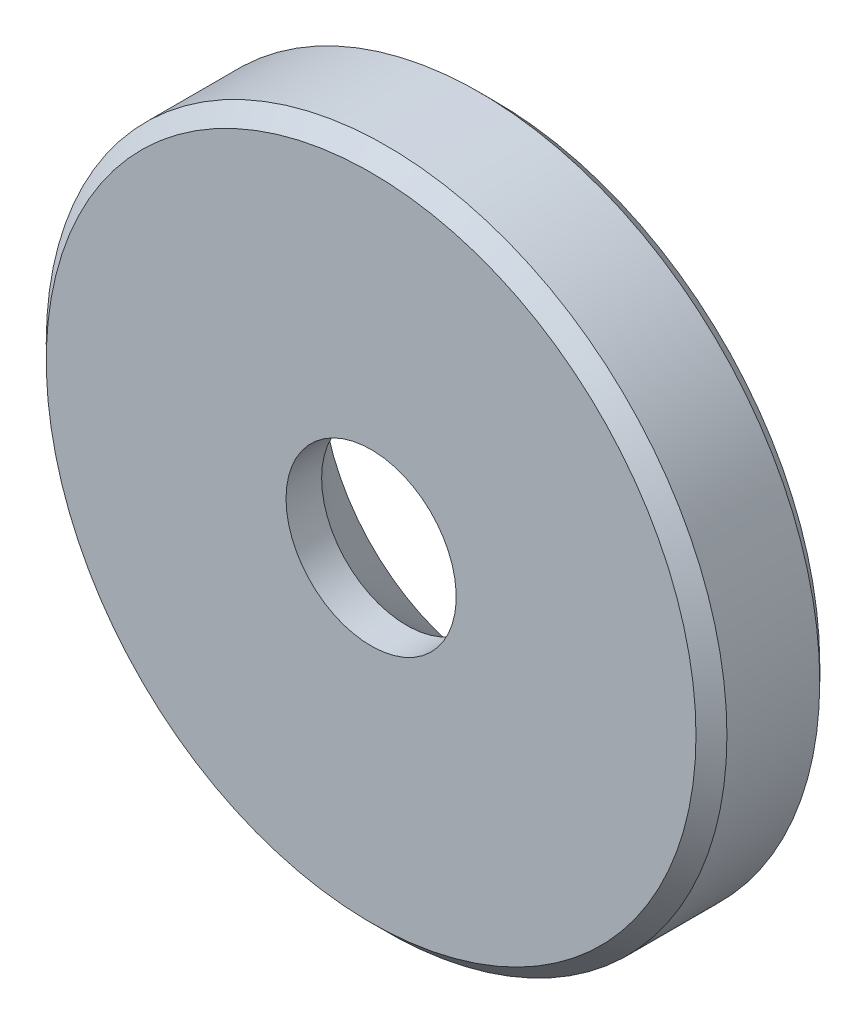
ISO-10303-21;
HEADER;
FILE_DESCRIPTION(('STEP AP214'),'2;1');
FILE_NAME('part.step','',(''),(''),'','','');
FILE_SCHEMA(('AUTOMOTIVE_DESIGN { 1 0 10303 214 1 1 1 1 }'));
ENDSEC;
DATA;
#1=APPLICATION_CONTEXT('core data for automotive mechanical design processes');
#2=APPLICATION_PROTOCOL_DEFINITION('international standard','automotive_design',2000,#1);
#3=PRODUCT_CONTEXT('',#1,'mechanical');
#4=PRODUCT('Part','Part','',(#3));
#5=PRODUCT_RELATED_PRODUCT_CATEGORY('part','',(#4));
#6=PRODUCT_DEFINITION_FORMATION('','',#4);
#7=PRODUCT_DEFINITION_CONTEXT('part definition',#1,'design');
#8=PRODUCT_DEFINITION('design','',#6,#7);
#9=PRODUCT_DEFINITION_SHAPE('','',#8);
#10=(LENGTH_UNIT() NAMED_UNIT(*) SI_UNIT(.MILLI.,.METRE.));
#11=(NAMED_UNIT(*) PLANE_ANGLE_UNIT() SI_UNIT($,.RADIAN.));
#12=(NAMED_UNIT(*) SI_UNIT($,.STERADIAN.) SOLID_ANGLE_UNIT());
#13=UNCERTAINTY_MEASURE_WITH_UNIT(LENGTH_MEASURE(1.E-05),#10,'distance_accuracy_value','');
#14=(GEOMETRIC_REPRESENTATION_CONTEXT(3) GLOBAL_UNCERTAINTY_ASSIGNED_CONTEXT((#13)) GLOBAL_UNIT_ASSIGNED_CONTEXT((#10,
#11,#12)) REPRESENTATION_CONTEXT('',''));
#15=CARTESIAN_POINT('',(0.,0.,0.));
#16=DIRECTION('',(0.,0.,1.));
#17=DIRECTION('',(1.,0.,0.));
#18=AXIS2_PLACEMENT_3D('',#15,#16,#17);
#19=CARTESIAN_POINT('',(0.,0.,4.));
#20=DIRECTION('',(0.,0.,-1.));
#21=DIRECTION('',(-1.,0.,0.));
#22=AXIS2_PLACEMENT_3D('',#19,#20,#21);
#23=CYLINDRICAL_SURFACE('',#22,11.);
#24=CARTESIAN_POINT('',(0.,0.,0.499999999999997));
#25=DIRECTION('',(0.,0.,1.));
#26=DIRECTION('',(1.,0.,0.));
#27=AXIS2_PLACEMENT_3D('',#24,#25,#26);
#28=CIRCLE('',#27,11.);
#29=CARTESIAN_POINT('',(11.,0.,0.499999999999997));
#30=VERTEX_POINT('',#29);
#31=EDGE_CURVE('E43',#30,#30,#28,.T.);
#32=ORIENTED_EDGE('',*,*,#31,.T.);
#33=EDGE_LOOP('',(#32));
#34=FACE_BOUND('',#33,.T.);
#35=CARTESIAN_POINT('',(0.,0.,3.49999999999999));
#36=DIRECTION('',(0.,0.,1.));
#37=DIRECTION('',(1.,0.,0.));
#38=AXIS2_PLACEMENT_3D('',#35,#36,#37);
#39=CIRCLE('',#38,11.);
#40=CARTESIAN_POINT('',(11.,0.,3.49999999999999));
#41=VERTEX_POINT('',#40);
#42=EDGE_CURVE('E47',#41,#41,#39,.F.);
#43=ORIENTED_EDGE('',*,*,#42,.T.);
#44=EDGE_LOOP('',(#43));
#45=FACE_BOUND('',#44,.T.);
#46=ADVANCED_FACE('F32',(#34,#45),#23,.T.);
#47=CARTESIAN_POINT('',(0.,0.,4.));
#48=DIRECTION('',(0.,0.,1.));
#49=DIRECTION('',(1.,0.,0.));
#50=AXIS2_PLACEMENT_3D('',#47,#48,#49);
#51=PLANE('',#50);
#52=CARTESIAN_POINT('',(0.,0.,4.));
#53=DIRECTION('',(0.,0.,-1.));
#54=DIRECTION('',(-1.,0.,0.));
#55=AXIS2_PLACEMENT_3D('',#52,#53,#54);
#56=CIRCLE('',#55,2.75);
#57=CARTESIAN_POINT('',(-2.75,0.,4.));
#58=VERTEX_POINT('',#57);
#59=EDGE_CURVE('E52',#58,#58,#56,.T.);
#60=ORIENTED_EDGE('',*,*,#59,.T.);
#61=EDGE_LOOP('',(#60));
#62=FACE_BOUND('',#61,.T.);
#63=CARTESIAN_POINT('',(0.,0.,4.));
#64=DIRECTION('',(0.,0.,1.));
#65=DIRECTION('',(1.,0.,0.));
#66=AXIS2_PLACEMENT_3D('',#63,#64,#65);
#67=CIRCLE('',#66,10.5);
#68=CARTESIAN_POINT('',(10.5,0.,4.));
#69=VERTEX_POINT('',#68);
#70=EDGE_CURVE('E10',#69,#69,#67,.T.);
#71=ORIENTED_EDGE('',*,*,#70,.T.);
#72=EDGE_LOOP('',(#71));
#73=FACE_BOUND('',#72,.T.);
#74=ADVANCED_FACE('F67',(#62,#73),#51,.T.);
#75=CARTESIAN_POINT('',(0.,0.,0.));
#76=DIRECTION('',(0.,0.,1.));
#77=DIRECTION('',(1.,0.,0.));
#78=AXIS2_PLACEMENT_3D('',#75,#76,#77);
#79=PLANE('',#78);
#80=CARTESIAN_POINT('',(0.,0.,0.));
#81=DIRECTION('',(0.,0.,-1.));
#82=DIRECTION('',(-1.,0.,0.));
#83=AXIS2_PLACEMENT_3D('',#80,#81,#82);
#84=CIRCLE('',#83,5.6);
#85=CARTESIAN_POINT('',(-5.6,0.,0.));
#86=VERTEX_POINT('',#85);
#87=EDGE_CURVE('E58',#86,#86,#84,.T.);
#88=ORIENTED_EDGE('',*,*,#87,.F.);
#89=EDGE_LOOP('',(#88));
#90=FACE_BOUND('',#89,.T.);
#91=CARTESIAN_POINT('',(0.,0.,0.));
#92=DIRECTION('',(0.,0.,1.));
#93=DIRECTION('',(1.,0.,0.));
#94=AXIS2_PLACEMENT_3D('',#91,#92,#93);
#95=CIRCLE('',#94,10.5);
#96=CARTESIAN_POINT('',(10.5,0.,0.));
#97=VERTEX_POINT('',#96);
#98=EDGE_CURVE('E39',#97,#97,#95,.F.);
#99=ORIENTED_EDGE('',*,*,#98,.T.);
#100=EDGE_LOOP('',(#99));
#101=FACE_BOUND('',#100,.T.);
#102=ADVANCED_FACE('F64',(#90,#101),#79,.F.);
#103=CARTESIAN_POINT('',(0.,0.,0.499999999999997));
#104=DIRECTION('',(0.,0.,1.));
#105=DIRECTION('',(1.,0.,0.));
#106=AXIS2_PLACEMENT_3D('',#103,#104,#105);
#107=CONICAL_SURFACE('',#106,11.,0.78539816339745);
#108=ORIENTED_EDGE('',*,*,#98,.F.);
#109=EDGE_LOOP('',(#108));
#110=FACE_BOUND('',#109,.T.);
#111=ORIENTED_EDGE('',*,*,#31,.F.);
#112=EDGE_LOOP('',(#111));
#113=FACE_BOUND('',#112,.T.);
#114=ADVANCED_FACE('F66',(#110,#113),#107,.T.);
#115=CARTESIAN_POINT('',(0.,0.,4.));
#116=DIRECTION('',(0.,0.,-1.));
#117=DIRECTION('',(-1.,0.,0.));
#118=AXIS2_PLACEMENT_3D('',#115,#116,#117);
#119=CONICAL_SURFACE('',#118,10.5,0.785398163397447);
#120=ORIENTED_EDGE('',*,*,#42,.F.);
#121=EDGE_LOOP('',(#120));
#122=FACE_BOUND('',#121,.T.);
#123=ORIENTED_EDGE('',*,*,#70,.F.);
#124=EDGE_LOOP('',(#123));
#125=FACE_BOUND('',#124,.T.);
#126=ADVANCED_FACE('F34',(#122,#125),#119,.T.);
#127=CARTESIAN_POINT('',(0.,0.,0.));
#128=DIRECTION('',(0.,0.,-1.));
#129=DIRECTION('',(-1.,0.,0.));
#130=AXIS2_PLACEMENT_3D('',#127,#128,#129);
#131=CYLINDRICAL_SURFACE('',#130,2.75);
#132=ORIENTED_EDGE('',*,*,#59,.F.);
#133=EDGE_LOOP('',(#132));
#134=FACE_BOUND('',#133,.T.);
#135=CARTESIAN_POINT('',(0.,0.,2.85));
#136=DIRECTION('',(0.,0.,-1.));
#137=DIRECTION('',(-1.,0.,0.));
#138=AXIS2_PLACEMENT_3D('',#135,#136,#137);
#139=CIRCLE('',#138,2.75);
#140=CARTESIAN_POINT('',(-2.75,0.,2.85));
#141=VERTEX_POINT('',#140);
#142=EDGE_CURVE('E55',#141,#141,#139,.T.);
#143=ORIENTED_EDGE('',*,*,#142,.T.);
#144=EDGE_LOOP('',(#143));
#145=FACE_BOUND('',#144,.T.);
#146=ADVANCED_FACE('F87',(#134,#145),#131,.F.);
#147=CARTESIAN_POINT('',(0.,0.,0.));
#148=DIRECTION('',(0.,0.,-1.));
#149=DIRECTION('',(-1.,0.,0.));
#150=AXIS2_PLACEMENT_3D('',#147,#148,#149);
#151=CONICAL_SURFACE('',#150,5.6,0.785398163397449);
#152=ORIENTED_EDGE('',*,*,#142,.F.);
#153=EDGE_LOOP('',(#152));
#154=FACE_BOUND('',#153,.T.);
#155=ORIENTED_EDGE('',*,*,#87,.T.);
#156=EDGE_LOOP('',(#155));
#157=FACE_BOUND('',#156,.T.);
#158=ADVANCED_FACE('F62',(#154,#157),#151,.F.);
#159=CLOSED_SHELL('',(#46,#74,#102,#114,#126,#146,#158));
#160=MANIFOLD_SOLID_BREP('B2',#159);
#161=ADVANCED_BREP_SHAPE_REPRESENTATION('',(#18,#160),#14);
#162=SHAPE_DEFINITION_REPRESENTATION(#9,#161);
ENDSEC;
END-ISO-10303-21;
